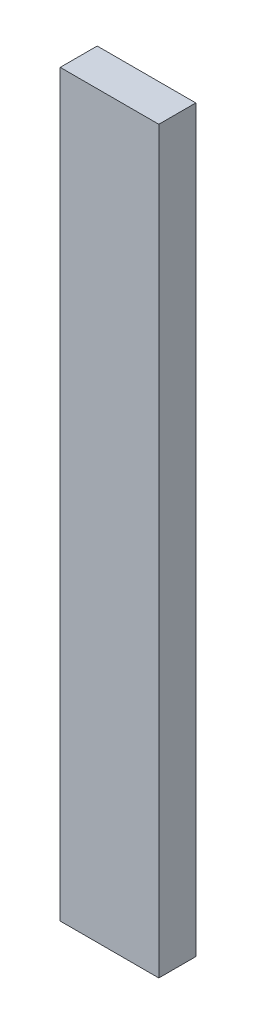
ISO-10303-21;
HEADER;
FILE_DESCRIPTION(('STEP AP214'),'2;1');
FILE_NAME('part.step','',(''),(''),'','','');
FILE_SCHEMA(('AUTOMOTIVE_DESIGN { 1 0 10303 214 1 1 1 1 }'));
ENDSEC;
DATA;
#1=APPLICATION_CONTEXT('core data for automotive mechanical design processes');
#2=APPLICATION_PROTOCOL_DEFINITION('international standard','automotive_design',2000,#1);
#3=PRODUCT_CONTEXT('',#1,'mechanical');
#4=PRODUCT('Part','Part','',(#3));
#5=PRODUCT_RELATED_PRODUCT_CATEGORY('part','',(#4));
#6=PRODUCT_DEFINITION_FORMATION('','',#4);
#7=PRODUCT_DEFINITION_CONTEXT('part definition',#1,'design');
#8=PRODUCT_DEFINITION('design','',#6,#7);
#9=PRODUCT_DEFINITION_SHAPE('','',#8);
#10=(LENGTH_UNIT() NAMED_UNIT(*) SI_UNIT(.MILLI.,.METRE.));
#11=(NAMED_UNIT(*) PLANE_ANGLE_UNIT() SI_UNIT($,.RADIAN.));
#12=(NAMED_UNIT(*) SI_UNIT($,.STERADIAN.) SOLID_ANGLE_UNIT());
#13=UNCERTAINTY_MEASURE_WITH_UNIT(LENGTH_MEASURE(1.E-05),#10,'distance_accuracy_value','');
#14=(GEOMETRIC_REPRESENTATION_CONTEXT(3) GLOBAL_UNCERTAINTY_ASSIGNED_CONTEXT((#13)) GLOBAL_UNIT_ASSIGNED_CONTEXT((#10,
#11,#12)) REPRESENTATION_CONTEXT('',''));
#15=CARTESIAN_POINT('',(0.,0.,0.));
#16=DIRECTION('',(0.,0.,1.));
#17=DIRECTION('',(1.,0.,0.));
#18=AXIS2_PLACEMENT_3D('',#15,#16,#17);
#19=CARTESIAN_POINT('',(25.4,-190.5,19.05));
#20=DIRECTION('',(-1.,0.,0.));
#21=DIRECTION('',(0.,0.,1.));
#22=AXIS2_PLACEMENT_3D('',#19,#20,#21);
#23=PLANE('',#22);
#24=DIRECTION('',(0.,1.,0.));
#25=VECTOR('',#24,1.);
#26=CARTESIAN_POINT('',(25.4,-190.5,0.));
#27=LINE('',#26,#25);
#28=CARTESIAN_POINT('',(25.4,-190.5,0.));
#29=VERTEX_POINT('',#28);
#30=CARTESIAN_POINT('',(25.4,190.5,0.));
#31=VERTEX_POINT('',#30);
#32=EDGE_CURVE('E96',#29,#31,#27,.T.);
#33=ORIENTED_EDGE('',*,*,#32,.T.);
#34=DIRECTION('',(0.,0.,-1.));
#35=VECTOR('',#34,1.);
#36=CARTESIAN_POINT('',(25.4,190.5,19.05));
#37=LINE('',#36,#35);
#38=CARTESIAN_POINT('',(25.4,190.5,19.05));
#39=VERTEX_POINT('',#38);
#40=EDGE_CURVE('E11',#39,#31,#37,.T.);
#41=ORIENTED_EDGE('',*,*,#40,.F.);
#42=DIRECTION('',(0.,1.,0.));
#43=VECTOR('',#42,1.);
#44=CARTESIAN_POINT('',(25.4,-190.5,19.05));
#45=LINE('',#44,#43);
#46=CARTESIAN_POINT('',(25.4,-190.5,19.05));
#47=VERTEX_POINT('',#46);
#48=EDGE_CURVE('E84',#47,#39,#45,.T.);
#49=ORIENTED_EDGE('',*,*,#48,.F.);
#50=DIRECTION('',(0.,0.,-1.));
#51=VECTOR('',#50,1.);
#52=CARTESIAN_POINT('',(25.4,-190.5,19.05));
#53=LINE('',#52,#51);
#54=EDGE_CURVE('E92',#47,#29,#53,.T.);
#55=ORIENTED_EDGE('',*,*,#54,.T.);
#56=EDGE_LOOP('',(#33,#41,#49,#55));
#57=FACE_BOUND('',#56,.T.);
#58=ADVANCED_FACE('F33',(#57),#23,.F.);
#59=CARTESIAN_POINT('',(-25.4,190.5,19.05));
#60=DIRECTION('',(0.,-1.,0.));
#61=DIRECTION('',(0.,0.,-1.));
#62=AXIS2_PLACEMENT_3D('',#59,#60,#61);
#63=PLANE('',#62);
#64=DIRECTION('',(-1.,0.,0.));
#65=VECTOR('',#64,1.);
#66=CARTESIAN_POINT('',(-25.4,190.5,0.));
#67=LINE('',#66,#65);
#68=CARTESIAN_POINT('',(-25.4,190.5,0.));
#69=VERTEX_POINT('',#68);
#70=EDGE_CURVE('E88',#31,#69,#67,.T.);
#71=ORIENTED_EDGE('',*,*,#70,.T.);
#72=DIRECTION('',(0.,0.,-1.));
#73=VECTOR('',#72,1.);
#74=CARTESIAN_POINT('',(-25.4,190.5,19.05));
#75=LINE('',#74,#73);
#76=CARTESIAN_POINT('',(-25.4,190.5,19.05));
#77=VERTEX_POINT('',#76);
#78=EDGE_CURVE('E41',#77,#69,#75,.T.);
#79=ORIENTED_EDGE('',*,*,#78,.F.);
#80=DIRECTION('',(-1.,0.,0.));
#81=VECTOR('',#80,1.);
#82=CARTESIAN_POINT('',(-25.4,190.5,19.05));
#83=LINE('',#82,#81);
#84=EDGE_CURVE('E79',#39,#77,#83,.T.);
#85=ORIENTED_EDGE('',*,*,#84,.F.);
#86=ORIENTED_EDGE('',*,*,#40,.T.);
#87=EDGE_LOOP('',(#71,#79,#85,#86));
#88=FACE_BOUND('',#87,.T.);
#89=ADVANCED_FACE('F87',(#88),#63,.F.);
#90=CARTESIAN_POINT('',(-25.4,-190.5,19.05));
#91=DIRECTION('',(1.,0.,0.));
#92=DIRECTION('',(0.,0.,-1.));
#93=AXIS2_PLACEMENT_3D('',#90,#91,#92);
#94=PLANE('',#93);
#95=DIRECTION('',(0.,-1.,0.));
#96=VECTOR('',#95,1.);
#97=CARTESIAN_POINT('',(-25.4,-190.5,0.));
#98=LINE('',#97,#96);
#99=CARTESIAN_POINT('',(-25.4,-190.5,0.));
#100=VERTEX_POINT('',#99);
#101=EDGE_CURVE('E66',#69,#100,#98,.T.);
#102=ORIENTED_EDGE('',*,*,#101,.T.);
#103=DIRECTION('',(0.,0.,-1.));
#104=VECTOR('',#103,1.);
#105=CARTESIAN_POINT('',(-25.4,-190.5,19.05));
#106=LINE('',#105,#104);
#107=CARTESIAN_POINT('',(-25.4,-190.5,19.05));
#108=VERTEX_POINT('',#107);
#109=EDGE_CURVE('E89',#108,#100,#106,.T.);
#110=ORIENTED_EDGE('',*,*,#109,.F.);
#111=DIRECTION('',(0.,-1.,0.));
#112=VECTOR('',#111,1.);
#113=CARTESIAN_POINT('',(-25.4,-190.5,19.05));
#114=LINE('',#113,#112);
#115=EDGE_CURVE('E82',#77,#108,#114,.T.);
#116=ORIENTED_EDGE('',*,*,#115,.F.);
#117=ORIENTED_EDGE('',*,*,#78,.T.);
#118=EDGE_LOOP('',(#102,#110,#116,#117));
#119=FACE_BOUND('',#118,.T.);
#120=ADVANCED_FACE('F90',(#119),#94,.F.);
#121=CARTESIAN_POINT('',(-25.4,-190.5,19.05));
#122=DIRECTION('',(0.,1.,0.));
#123=DIRECTION('',(0.,0.,1.));
#124=AXIS2_PLACEMENT_3D('',#121,#122,#123);
#125=PLANE('',#124);
#126=DIRECTION('',(1.,0.,0.));
#127=VECTOR('',#126,1.);
#128=CARTESIAN_POINT('',(-25.4,-190.5,0.));
#129=LINE('',#128,#127);
#130=EDGE_CURVE('E72',#100,#29,#129,.T.);
#131=ORIENTED_EDGE('',*,*,#130,.T.);
#132=ORIENTED_EDGE('',*,*,#54,.F.);
#133=DIRECTION('',(1.,0.,0.));
#134=VECTOR('',#133,1.);
#135=CARTESIAN_POINT('',(-25.4,-190.5,19.05));
#136=LINE('',#135,#134);
#137=EDGE_CURVE('E49',#108,#47,#136,.T.);
#138=ORIENTED_EDGE('',*,*,#137,.F.);
#139=ORIENTED_EDGE('',*,*,#109,.T.);
#140=EDGE_LOOP('',(#131,#132,#138,#139));
#141=FACE_BOUND('',#140,.T.);
#142=ADVANCED_FACE('F103',(#141),#125,.F.);
#143=CARTESIAN_POINT('',(0.,0.,19.05));
#144=DIRECTION('',(0.,0.,-1.));
#145=DIRECTION('',(-1.,0.,0.));
#146=AXIS2_PLACEMENT_3D('',#143,#144,#145);
#147=PLANE('',#146);
#148=ORIENTED_EDGE('',*,*,#48,.T.);
#149=ORIENTED_EDGE('',*,*,#84,.T.);
#150=ORIENTED_EDGE('',*,*,#115,.T.);
#151=ORIENTED_EDGE('',*,*,#137,.T.);
#152=EDGE_LOOP('',(#148,#149,#150,#151));
#153=FACE_BOUND('',#152,.T.);
#154=ADVANCED_FACE('F80',(#153),#147,.F.);
#155=CARTESIAN_POINT('',(0.,0.,0.));
#156=DIRECTION('',(0.,0.,-1.));
#157=DIRECTION('',(-1.,0.,0.));
#158=AXIS2_PLACEMENT_3D('',#155,#156,#157);
#159=PLANE('',#158);
#160=ORIENTED_EDGE('',*,*,#32,.F.);
#161=ORIENTED_EDGE('',*,*,#130,.F.);
#162=ORIENTED_EDGE('',*,*,#101,.F.);
#163=ORIENTED_EDGE('',*,*,#70,.F.);
#164=EDGE_LOOP('',(#160,#161,#162,#163));
#165=FACE_BOUND('',#164,.T.);
#166=ADVANCED_FACE('F106',(#165),#159,.T.);
#167=CLOSED_SHELL('',(#58,#89,#120,#142,#154,#166));
#168=MANIFOLD_SOLID_BREP('B2',#167);
#169=ADVANCED_BREP_SHAPE_REPRESENTATION('',(#18,#168),#14);
#170=SHAPE_DEFINITION_REPRESENTATION(#9,#169);
ENDSEC;
END-ISO-10303-21;
